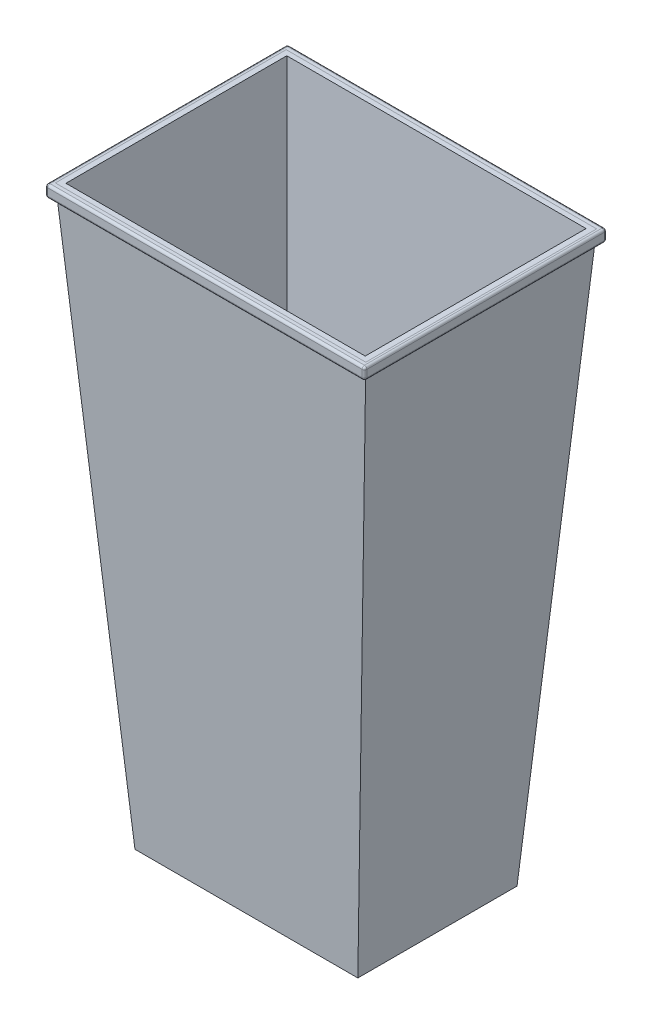
ISO-10303-21;
HEADER;
FILE_DESCRIPTION(('STEP AP214'),'2;1');
FILE_NAME('part.step','',(''),(''),'','','');
FILE_SCHEMA(('AUTOMOTIVE_DESIGN { 1 0 10303 214 1 1 1 1 }'));
ENDSEC;
DATA;
#1=APPLICATION_CONTEXT('core data for automotive mechanical design processes');
#2=APPLICATION_PROTOCOL_DEFINITION('international standard','automotive_design',2000,#1);
#3=PRODUCT_CONTEXT('',#1,'mechanical');
#4=PRODUCT('Part','Part','',(#3));
#5=PRODUCT_RELATED_PRODUCT_CATEGORY('part','',(#4));
#6=PRODUCT_DEFINITION_FORMATION('','',#4);
#7=PRODUCT_DEFINITION_CONTEXT('part definition',#1,'design');
#8=PRODUCT_DEFINITION('design','',#6,#7);
#9=PRODUCT_DEFINITION_SHAPE('','',#8);
#10=(LENGTH_UNIT() NAMED_UNIT(*) SI_UNIT(.MILLI.,.METRE.));
#11=(NAMED_UNIT(*) PLANE_ANGLE_UNIT() SI_UNIT($,.RADIAN.));
#12=(NAMED_UNIT(*) SI_UNIT($,.STERADIAN.) SOLID_ANGLE_UNIT());
#13=UNCERTAINTY_MEASURE_WITH_UNIT(LENGTH_MEASURE(1.E-05),#10,'distance_accuracy_value','');
#14=(GEOMETRIC_REPRESENTATION_CONTEXT(3) GLOBAL_UNCERTAINTY_ASSIGNED_CONTEXT((#13)) GLOBAL_UNIT_ASSIGNED_CONTEXT((#10,
#11,#12)) REPRESENTATION_CONTEXT('',''));
#15=CARTESIAN_POINT('',(0.,0.,0.));
#16=DIRECTION('',(0.,0.,1.));
#17=DIRECTION('',(1.,0.,0.));
#18=AXIS2_PLACEMENT_3D('',#15,#16,#17);
#19=CARTESIAN_POINT('',(200.524961783047,705.,-152.129640471292));
#20=DIRECTION('',(1.,0.,0.));
#21=DIRECTION('',(0.,0.,-1.));
#22=AXIS2_PLACEMENT_3D('',#19,#20,#21);
#23=PLANE('',#22);
#24=DIRECTION('',(0.,1.,0.));
#25=VECTOR('',#24,1.);
#26=CARTESIAN_POINT('',(200.524961783047,705.,149.129640471292));
#27=LINE('',#26,#25);
#28=CARTESIAN_POINT('',(200.524961783047,717.,149.129640471292));
#29=VERTEX_POINT('',#28);
#30=CARTESIAN_POINT('',(200.524961783047,708.,149.129640471292));
#31=VERTEX_POINT('',#30);
#32=EDGE_CURVE('E216',#29,#31,#27,.F.);
#33=ORIENTED_EDGE('',*,*,#32,.T.);
#34=DIRECTION('',(0.,0.,-1.));
#35=VECTOR('',#34,1.);
#36=CARTESIAN_POINT('',(200.524961783047,708.,-152.129640471292));
#37=LINE('',#36,#35);
#38=CARTESIAN_POINT('',(200.524961783047,708.,-149.129640471292));
#39=VERTEX_POINT('',#38);
#40=EDGE_CURVE('E221',#31,#39,#37,.T.);
#41=ORIENTED_EDGE('',*,*,#40,.T.);
#42=DIRECTION('',(0.,1.,0.));
#43=VECTOR('',#42,1.);
#44=CARTESIAN_POINT('',(200.524961783047,705.,-149.129640471292));
#45=LINE('',#44,#43);
#46=CARTESIAN_POINT('',(200.524961783047,717.,-149.129640471292));
#47=VERTEX_POINT('',#46);
#48=EDGE_CURVE('E218',#39,#47,#45,.T.);
#49=ORIENTED_EDGE('',*,*,#48,.T.);
#50=DIRECTION('',(0.,0.,-1.));
#51=VECTOR('',#50,1.);
#52=CARTESIAN_POINT('',(200.524961783047,717.,-152.129640471292));
#53=LINE('',#52,#51);
#54=EDGE_CURVE('E211',#47,#29,#53,.F.);
#55=ORIENTED_EDGE('',*,*,#54,.T.);
#56=EDGE_LOOP('',(#33,#41,#49,#55));
#57=FACE_BOUND('',#56,.T.);
#58=ADVANCED_FACE('F59',(#57),#23,.T.);
#59=CARTESIAN_POINT('',(-200.524961783047,705.,152.129640471292));
#60=DIRECTION('',(0.,0.,1.));
#61=DIRECTION('',(1.,0.,0.));
#62=AXIS2_PLACEMENT_3D('',#59,#60,#61);
#63=PLANE('',#62);
#64=DIRECTION('',(0.,1.,0.));
#65=VECTOR('',#64,1.);
#66=CARTESIAN_POINT('',(-197.524961783047,705.,152.129640471292));
#67=LINE('',#66,#65);
#68=CARTESIAN_POINT('',(-197.524961783047,717.,152.129640471292));
#69=VERTEX_POINT('',#68);
#70=CARTESIAN_POINT('',(-197.524961783047,708.,152.129640471292));
#71=VERTEX_POINT('',#70);
#72=EDGE_CURVE('E68',#69,#71,#67,.F.);
#73=ORIENTED_EDGE('',*,*,#72,.T.);
#74=DIRECTION('',(1.,0.,0.));
#75=VECTOR('',#74,1.);
#76=CARTESIAN_POINT('',(200.524961783047,708.,152.129640471292));
#77=LINE('',#76,#75);
#78=CARTESIAN_POINT('',(197.524961783047,708.,152.129640471292));
#79=VERTEX_POINT('',#78);
#80=EDGE_CURVE('E13',#71,#79,#77,.T.);
#81=ORIENTED_EDGE('',*,*,#80,.T.);
#82=DIRECTION('',(0.,1.,0.));
#83=VECTOR('',#82,1.);
#84=CARTESIAN_POINT('',(197.524961783047,705.,152.129640471292));
#85=LINE('',#84,#83);
#86=CARTESIAN_POINT('',(197.524961783047,717.,152.129640471292));
#87=VERTEX_POINT('',#86);
#88=EDGE_CURVE('E261',#79,#87,#85,.T.);
#89=ORIENTED_EDGE('',*,*,#88,.T.);
#90=DIRECTION('',(1.,0.,0.));
#91=VECTOR('',#90,1.);
#92=CARTESIAN_POINT('',(-200.524961783047,717.,152.129640471292));
#93=LINE('',#92,#91);
#94=EDGE_CURVE('E259',#87,#69,#93,.F.);
#95=ORIENTED_EDGE('',*,*,#94,.T.);
#96=EDGE_LOOP('',(#73,#81,#89,#95));
#97=FACE_BOUND('',#96,.T.);
#98=ADVANCED_FACE('F361',(#97),#63,.T.);
#99=CARTESIAN_POINT('',(-200.524961783047,705.,-152.129640471292));
#100=DIRECTION('',(-1.,0.,0.));
#101=DIRECTION('',(0.,0.,1.));
#102=AXIS2_PLACEMENT_3D('',#99,#100,#101);
#103=PLANE('',#102);
#104=DIRECTION('',(0.,1.,0.));
#105=VECTOR('',#104,1.);
#106=CARTESIAN_POINT('',(-200.524961783047,705.,-149.129640471292));
#107=LINE('',#106,#105);
#108=CARTESIAN_POINT('',(-200.524961783047,717.,-149.129640471292));
#109=VERTEX_POINT('',#108);
#110=CARTESIAN_POINT('',(-200.524961783047,708.,-149.129640471292));
#111=VERTEX_POINT('',#110);
#112=EDGE_CURVE('E254',#109,#111,#107,.F.);
#113=ORIENTED_EDGE('',*,*,#112,.T.);
#114=DIRECTION('',(0.,0.,1.));
#115=VECTOR('',#114,1.);
#116=CARTESIAN_POINT('',(-200.524961783047,708.,152.129640471292));
#117=LINE('',#116,#115);
#118=CARTESIAN_POINT('',(-200.524961783047,708.,149.129640471292));
#119=VERTEX_POINT('',#118);
#120=EDGE_CURVE('E257',#111,#119,#117,.T.);
#121=ORIENTED_EDGE('',*,*,#120,.T.);
#122=DIRECTION('',(0.,1.,0.));
#123=VECTOR('',#122,1.);
#124=CARTESIAN_POINT('',(-200.524961783047,705.,149.129640471292));
#125=LINE('',#124,#123);
#126=CARTESIAN_POINT('',(-200.524961783047,717.,149.129640471292));
#127=VERTEX_POINT('',#126);
#128=EDGE_CURVE('E252',#119,#127,#125,.T.);
#129=ORIENTED_EDGE('',*,*,#128,.T.);
#130=DIRECTION('',(0.,0.,1.));
#131=VECTOR('',#130,1.);
#132=CARTESIAN_POINT('',(-200.524961783047,717.,-152.129640471292));
#133=LINE('',#132,#131);
#134=EDGE_CURVE('E250',#127,#109,#133,.F.);
#135=ORIENTED_EDGE('',*,*,#134,.T.);
#136=EDGE_LOOP('',(#113,#121,#129,#135));
#137=FACE_BOUND('',#136,.T.);
#138=ADVANCED_FACE('F368',(#137),#103,.T.);
#139=CARTESIAN_POINT('',(-200.524961783047,705.,-152.129640471292));
#140=DIRECTION('',(0.,0.,-1.));
#141=DIRECTION('',(-1.,0.,0.));
#142=AXIS2_PLACEMENT_3D('',#139,#140,#141);
#143=PLANE('',#142);
#144=DIRECTION('',(-1.,0.,0.));
#145=VECTOR('',#144,1.);
#146=CARTESIAN_POINT('',(-200.524961783047,717.,-152.129640471292));
#147=LINE('',#146,#145);
#148=CARTESIAN_POINT('',(-197.524961783047,717.,-152.129640471292));
#149=VERTEX_POINT('',#148);
#150=CARTESIAN_POINT('',(197.524961783047,717.,-152.129640471292));
#151=VERTEX_POINT('',#150);
#152=EDGE_CURVE('E225',#149,#151,#147,.F.);
#153=ORIENTED_EDGE('',*,*,#152,.T.);
#154=DIRECTION('',(0.,1.,0.));
#155=VECTOR('',#154,1.);
#156=CARTESIAN_POINT('',(197.524961783047,705.,-152.129640471292));
#157=LINE('',#156,#155);
#158=CARTESIAN_POINT('',(197.524961783047,708.,-152.129640471292));
#159=VERTEX_POINT('',#158);
#160=EDGE_CURVE('E229',#151,#159,#157,.F.);
#161=ORIENTED_EDGE('',*,*,#160,.T.);
#162=DIRECTION('',(-1.,0.,0.));
#163=VECTOR('',#162,1.);
#164=CARTESIAN_POINT('',(-200.524961783047,708.,-152.129640471292));
#165=LINE('',#164,#163);
#166=CARTESIAN_POINT('',(-197.524961783047,708.,-152.129640471292));
#167=VERTEX_POINT('',#166);
#168=EDGE_CURVE('E227',#159,#167,#165,.T.);
#169=ORIENTED_EDGE('',*,*,#168,.T.);
#170=DIRECTION('',(0.,1.,0.));
#171=VECTOR('',#170,1.);
#172=CARTESIAN_POINT('',(-197.524961783047,705.,-152.129640471292));
#173=LINE('',#172,#171);
#174=EDGE_CURVE('E223',#167,#149,#173,.T.);
#175=ORIENTED_EDGE('',*,*,#174,.T.);
#176=EDGE_LOOP('',(#153,#161,#169,#175));
#177=FACE_BOUND('',#176,.T.);
#178=ADVANCED_FACE('F372',(#177),#143,.T.);
#179=CARTESIAN_POINT('',(0.,705.,0.));
#180=DIRECTION('',(0.,1.,0.));
#181=DIRECTION('',(0.,0.,1.));
#182=AXIS2_PLACEMENT_3D('',#179,#180,#181);
#183=PLANE('',#182);
#184=DIRECTION('',(0.,0.,1.));
#185=VECTOR('',#184,1.);
#186=CARTESIAN_POINT('',(-197.524961783047,705.,-152.129640471292));
#187=LINE('',#186,#185);
#188=CARTESIAN_POINT('',(-197.524961783047,705.,149.129640471292));
#189=VERTEX_POINT('',#188);
#190=CARTESIAN_POINT('',(-197.524961783047,705.,-149.129640471292));
#191=VERTEX_POINT('',#190);
#192=EDGE_CURVE('E234',#189,#191,#187,.F.);
#193=ORIENTED_EDGE('',*,*,#192,.T.);
#194=DIRECTION('',(-1.,0.,0.));
#195=VECTOR('',#194,1.);
#196=CARTESIAN_POINT('',(200.524961783047,705.,-149.129640471292));
#197=LINE('',#196,#195);
#198=CARTESIAN_POINT('',(197.524961783047,705.,-149.129640471292));
#199=VERTEX_POINT('',#198);
#200=EDGE_CURVE('E238',#191,#199,#197,.F.);
#201=ORIENTED_EDGE('',*,*,#200,.T.);
#202=DIRECTION('',(0.,0.,-1.));
#203=VECTOR('',#202,1.);
#204=CARTESIAN_POINT('',(197.524961783047,705.,152.129640471292));
#205=LINE('',#204,#203);
#206=CARTESIAN_POINT('',(197.524961783047,705.,149.129640471292));
#207=VERTEX_POINT('',#206);
#208=EDGE_CURVE('E236',#199,#207,#205,.F.);
#209=ORIENTED_EDGE('',*,*,#208,.T.);
#210=DIRECTION('',(1.,0.,0.));
#211=VECTOR('',#210,1.);
#212=CARTESIAN_POINT('',(-200.524961783047,705.,149.129640471292));
#213=LINE('',#212,#211);
#214=EDGE_CURVE('E232',#207,#189,#213,.F.);
#215=ORIENTED_EDGE('',*,*,#214,.T.);
#216=EDGE_LOOP('',(#193,#201,#209,#215));
#217=FACE_BOUND('',#216,.T.);
#218=DIRECTION('',(1.,0.,0.));
#219=VECTOR('',#218,1.);
#220=CARTESIAN_POINT('',(-195.,705.,145.));
#221=LINE('',#220,#219);
#222=CARTESIAN_POINT('',(-195.,705.,145.));
#223=VERTEX_POINT('',#222);
#224=CARTESIAN_POINT('',(195.,705.,145.));
#225=VERTEX_POINT('',#224);
#226=EDGE_CURVE('E184',#223,#225,#221,.T.);
#227=ORIENTED_EDGE('',*,*,#226,.T.);
#228=DIRECTION('',(0.,0.,-1.));
#229=VECTOR('',#228,1.);
#230=CARTESIAN_POINT('',(195.,705.,-145.));
#231=LINE('',#230,#229);
#232=CARTESIAN_POINT('',(195.,705.,-145.));
#233=VERTEX_POINT('',#232);
#234=EDGE_CURVE('E176',#225,#233,#231,.T.);
#235=ORIENTED_EDGE('',*,*,#234,.T.);
#236=DIRECTION('',(-1.,0.,0.));
#237=VECTOR('',#236,1.);
#238=CARTESIAN_POINT('',(-195.,705.,-145.));
#239=LINE('',#238,#237);
#240=CARTESIAN_POINT('',(-195.,705.,-145.));
#241=VERTEX_POINT('',#240);
#242=EDGE_CURVE('E188',#233,#241,#239,.T.);
#243=ORIENTED_EDGE('',*,*,#242,.T.);
#244=DIRECTION('',(0.,0.,1.));
#245=VECTOR('',#244,1.);
#246=CARTESIAN_POINT('',(-195.,705.,-145.));
#247=LINE('',#246,#245);
#248=EDGE_CURVE('E192',#241,#223,#247,.T.);
#249=ORIENTED_EDGE('',*,*,#248,.T.);
#250=EDGE_LOOP('',(#227,#235,#243,#249));
#251=FACE_BOUND('',#250,.T.);
#252=ADVANCED_FACE('F194',(#217,#251),#183,.F.);
#253=CARTESIAN_POINT('',(0.,720.,0.));
#254=DIRECTION('',(0.,1.,0.));
#255=DIRECTION('',(0.,0.,1.));
#256=AXIS2_PLACEMENT_3D('',#253,#254,#255);
#257=PLANE('',#256);
#258=DIRECTION('',(0.,0.,-1.));
#259=VECTOR('',#258,1.);
#260=CARTESIAN_POINT('',(197.524961783047,720.,0.));
#261=LINE('',#260,#259);
#262=CARTESIAN_POINT('',(197.524961783047,720.,149.129640471292));
#263=VERTEX_POINT('',#262);
#264=CARTESIAN_POINT('',(197.524961783047,720.,-149.129640471292));
#265=VERTEX_POINT('',#264);
#266=EDGE_CURVE('E245',#263,#265,#261,.T.);
#267=ORIENTED_EDGE('',*,*,#266,.T.);
#268=DIRECTION('',(-1.,0.,0.));
#269=VECTOR('',#268,1.);
#270=CARTESIAN_POINT('',(0.,720.,-149.129640471292));
#271=LINE('',#270,#269);
#272=CARTESIAN_POINT('',(-197.524961783047,720.,-149.129640471292));
#273=VERTEX_POINT('',#272);
#274=EDGE_CURVE('E247',#265,#273,#271,.T.);
#275=ORIENTED_EDGE('',*,*,#274,.T.);
#276=DIRECTION('',(0.,0.,1.));
#277=VECTOR('',#276,1.);
#278=CARTESIAN_POINT('',(-197.524961783047,720.,0.));
#279=LINE('',#278,#277);
#280=CARTESIAN_POINT('',(-197.524961783047,720.,149.129640471292));
#281=VERTEX_POINT('',#280);
#282=EDGE_CURVE('E243',#273,#281,#279,.T.);
#283=ORIENTED_EDGE('',*,*,#282,.T.);
#284=DIRECTION('',(1.,0.,0.));
#285=VECTOR('',#284,1.);
#286=CARTESIAN_POINT('',(0.,720.,149.129640471292));
#287=LINE('',#286,#285);
#288=EDGE_CURVE('E241',#281,#263,#287,.T.);
#289=ORIENTED_EDGE('',*,*,#288,.T.);
#290=EDGE_LOOP('',(#267,#275,#283,#289));
#291=FACE_BOUND('',#290,.T.);
#292=DIRECTION('',(0.,0.,-1.));
#293=VECTOR('',#292,1.);
#294=CARTESIAN_POINT('',(195.,720.,-145.));
#295=LINE('',#294,#293);
#296=CARTESIAN_POINT('',(195.,720.,145.));
#297=VERTEX_POINT('',#296);
#298=CARTESIAN_POINT('',(195.,720.,-145.));
#299=VERTEX_POINT('',#298);
#300=EDGE_CURVE('E179',#297,#299,#295,.T.);
#301=ORIENTED_EDGE('',*,*,#300,.F.);
#302=DIRECTION('',(1.,0.,0.));
#303=VECTOR('',#302,1.);
#304=CARTESIAN_POINT('',(-195.,720.,145.));
#305=LINE('',#304,#303);
#306=CARTESIAN_POINT('',(-195.,720.,145.));
#307=VERTEX_POINT('',#306);
#308=EDGE_CURVE('E196',#307,#297,#305,.T.);
#309=ORIENTED_EDGE('',*,*,#308,.F.);
#310=DIRECTION('',(0.,0.,1.));
#311=VECTOR('',#310,1.);
#312=CARTESIAN_POINT('',(-195.,720.,-145.));
#313=LINE('',#312,#311);
#314=CARTESIAN_POINT('',(-195.,720.,-145.));
#315=VERTEX_POINT('',#314);
#316=EDGE_CURVE('E199',#315,#307,#313,.T.);
#317=ORIENTED_EDGE('',*,*,#316,.F.);
#318=DIRECTION('',(-1.,0.,0.));
#319=VECTOR('',#318,1.);
#320=CARTESIAN_POINT('',(-195.,720.,-145.));
#321=LINE('',#320,#319);
#322=EDGE_CURVE('E205',#299,#315,#321,.T.);
#323=ORIENTED_EDGE('',*,*,#322,.F.);
#324=EDGE_LOOP('',(#301,#309,#317,#323));
#325=FACE_BOUND('',#324,.T.);
#326=ADVANCED_FACE('F468',(#291,#325),#257,.T.);
#327=CARTESIAN_POINT('',(195.,705.,-145.));
#328=DIRECTION('',(1.,0.,0.));
#329=DIRECTION('',(0.,0.,-1.));
#330=AXIS2_PLACEMENT_3D('',#327,#328,#329);
#331=PLANE('',#330);
#332=ORIENTED_EDGE('',*,*,#300,.T.);
#333=DIRECTION('',(0.,1.,0.));
#334=VECTOR('',#333,1.);
#335=CARTESIAN_POINT('',(195.,705.,-145.));
#336=LINE('',#335,#334);
#337=EDGE_CURVE('E172',#233,#299,#336,.T.);
#338=ORIENTED_EDGE('',*,*,#337,.F.);
#339=ORIENTED_EDGE('',*,*,#234,.F.);
#340=DIRECTION('',(0.,1.,0.));
#341=VECTOR('',#340,1.);
#342=CARTESIAN_POINT('',(195.,705.,145.));
#343=LINE('',#342,#341);
#344=EDGE_CURVE('E209',#225,#297,#343,.T.);
#345=ORIENTED_EDGE('',*,*,#344,.T.);
#346=EDGE_LOOP('',(#332,#338,#339,#345));
#347=FACE_BOUND('',#346,.T.);
#348=ADVANCED_FACE('F174',(#347),#331,.F.);
#349=CARTESIAN_POINT('',(-195.,705.,145.));
#350=DIRECTION('',(0.,0.,1.));
#351=DIRECTION('',(1.,0.,0.));
#352=AXIS2_PLACEMENT_3D('',#349,#350,#351);
#353=PLANE('',#352);
#354=ORIENTED_EDGE('',*,*,#308,.T.);
#355=ORIENTED_EDGE('',*,*,#344,.F.);
#356=ORIENTED_EDGE('',*,*,#226,.F.);
#357=DIRECTION('',(0.,1.,0.));
#358=VECTOR('',#357,1.);
#359=CARTESIAN_POINT('',(-195.,705.,145.));
#360=LINE('',#359,#358);
#361=EDGE_CURVE('E212',#223,#307,#360,.T.);
#362=ORIENTED_EDGE('',*,*,#361,.T.);
#363=EDGE_LOOP('',(#354,#355,#356,#362));
#364=FACE_BOUND('',#363,.T.);
#365=ADVANCED_FACE('F461',(#364),#353,.F.);
#366=CARTESIAN_POINT('',(-195.,705.,-145.));
#367=DIRECTION('',(-1.,0.,0.));
#368=DIRECTION('',(0.,0.,1.));
#369=AXIS2_PLACEMENT_3D('',#366,#367,#368);
#370=PLANE('',#369);
#371=ORIENTED_EDGE('',*,*,#316,.T.);
#372=ORIENTED_EDGE('',*,*,#361,.F.);
#373=ORIENTED_EDGE('',*,*,#248,.F.);
#374=DIRECTION('',(0.,1.,0.));
#375=VECTOR('',#374,1.);
#376=CARTESIAN_POINT('',(-195.,705.,-145.));
#377=LINE('',#376,#375);
#378=EDGE_CURVE('E183',#241,#315,#377,.T.);
#379=ORIENTED_EDGE('',*,*,#378,.T.);
#380=EDGE_LOOP('',(#371,#372,#373,#379));
#381=FACE_BOUND('',#380,.T.);
#382=ADVANCED_FACE('F456',(#381),#370,.F.);
#383=CARTESIAN_POINT('',(-195.,705.,-145.));
#384=DIRECTION('',(0.,0.,-1.));
#385=DIRECTION('',(-1.,0.,0.));
#386=AXIS2_PLACEMENT_3D('',#383,#384,#385);
#387=PLANE('',#386);
#388=ORIENTED_EDGE('',*,*,#322,.T.);
#389=ORIENTED_EDGE('',*,*,#378,.F.);
#390=ORIENTED_EDGE('',*,*,#242,.F.);
#391=ORIENTED_EDGE('',*,*,#337,.T.);
#392=EDGE_LOOP('',(#388,#389,#390,#391));
#393=FACE_BOUND('',#392,.T.);
#394=ADVANCED_FACE('F189',(#393),#387,.F.);
#395=CARTESIAN_POINT('',(-197.524961783047,705.,149.129640471292));
#396=DIRECTION('',(0.,1.,0.));
#397=DIRECTION('',(0.,0.,1.));
#398=AXIS2_PLACEMENT_3D('',#395,#396,#397);
#399=CYLINDRICAL_SURFACE('',#398,3.);
#400=CARTESIAN_POINT('',(-197.524961783047,708.,149.129640471292));
#401=DIRECTION('',(0.,-1.,0.));
#402=DIRECTION('',(0.,0.,-1.));
#403=AXIS2_PLACEMENT_3D('',#400,#401,#402);
#404=CIRCLE('',#403,3.);
#405=EDGE_CURVE('E63',#71,#119,#404,.T.);
#406=ORIENTED_EDGE('',*,*,#405,.F.);
#407=ORIENTED_EDGE('',*,*,#72,.F.);
#408=CARTESIAN_POINT('',(-197.524961783047,717.,149.129640471292));
#409=DIRECTION('',(0.,1.,0.));
#410=DIRECTION('',(0.,0.,1.));
#411=AXIS2_PLACEMENT_3D('',#408,#409,#410);
#412=CIRCLE('',#411,3.);
#413=EDGE_CURVE('E323',#127,#69,#412,.T.);
#414=ORIENTED_EDGE('',*,*,#413,.F.);
#415=ORIENTED_EDGE('',*,*,#128,.F.);
#416=EDGE_LOOP('',(#406,#407,#414,#415));
#417=FACE_BOUND('',#416,.T.);
#418=ADVANCED_FACE('F61',(#417),#399,.T.);
#419=CARTESIAN_POINT('',(-197.524961783047,708.,149.129640471292));
#420=DIRECTION('',(-1.,0.,0.));
#421=DIRECTION('',(0.,0.,1.));
#422=AXIS2_PLACEMENT_3D('',#419,#420,#421);
#423=SPHERICAL_SURFACE('',#422,3.);
#424=CARTESIAN_POINT('',(-197.524961783047,708.,149.129640471292));
#425=DIRECTION('',(-1.,0.,0.));
#426=DIRECTION('',(0.,0.,1.));
#427=AXIS2_PLACEMENT_3D('',#424,#425,#426);
#428=CIRCLE('',#427,3.);
#429=EDGE_CURVE('E319',#71,#189,#428,.F.);
#430=ORIENTED_EDGE('',*,*,#429,.F.);
#431=ORIENTED_EDGE('',*,*,#405,.T.);
#432=CARTESIAN_POINT('',(-197.524961783047,708.,149.129640471292));
#433=DIRECTION('',(0.,0.,1.));
#434=DIRECTION('',(1.,0.,0.));
#435=AXIS2_PLACEMENT_3D('',#432,#433,#434);
#436=CIRCLE('',#435,3.);
#437=EDGE_CURVE('E321',#189,#119,#436,.F.);
#438=ORIENTED_EDGE('',*,*,#437,.F.);
#439=EDGE_LOOP('',(#430,#431,#438));
#440=FACE_BOUND('',#439,.T.);
#441=ADVANCED_FACE('F333',(#440),#423,.T.);
#442=CARTESIAN_POINT('',(-197.524961783047,717.,149.129640471292));
#443=DIRECTION('',(0.,0.,1.));
#444=DIRECTION('',(1.,0.,0.));
#445=AXIS2_PLACEMENT_3D('',#442,#443,#444);
#446=SPHERICAL_SURFACE('',#445,3.);
#447=CARTESIAN_POINT('',(-197.524961783047,717.,149.129640471292));
#448=DIRECTION('',(0.,0.,1.));
#449=DIRECTION('',(1.,0.,0.));
#450=AXIS2_PLACEMENT_3D('',#447,#448,#449);
#451=CIRCLE('',#450,3.);
#452=EDGE_CURVE('E313',#127,#281,#451,.F.);
#453=ORIENTED_EDGE('',*,*,#452,.F.);
#454=ORIENTED_EDGE('',*,*,#413,.T.);
#455=CARTESIAN_POINT('',(-197.524961783047,717.,149.129640471292));
#456=DIRECTION('',(-1.,0.,0.));
#457=DIRECTION('',(0.,0.,1.));
#458=AXIS2_PLACEMENT_3D('',#455,#456,#457);
#459=CIRCLE('',#458,3.);
#460=EDGE_CURVE('E316',#281,#69,#459,.F.);
#461=ORIENTED_EDGE('',*,*,#460,.F.);
#462=EDGE_LOOP('',(#453,#454,#461));
#463=FACE_BOUND('',#462,.T.);
#464=ADVANCED_FACE('F358',(#463),#446,.T.);
#465=CARTESIAN_POINT('',(-197.524961783047,708.,-152.129640471292));
#466=DIRECTION('',(0.,0.,-1.));
#467=DIRECTION('',(-1.,0.,0.));
#468=AXIS2_PLACEMENT_3D('',#465,#466,#467);
#469=CYLINDRICAL_SURFACE('',#468,3.);
#470=ORIENTED_EDGE('',*,*,#437,.T.);
#471=ORIENTED_EDGE('',*,*,#120,.F.);
#472=CARTESIAN_POINT('',(-197.524961783047,708.,-149.129640471292));
#473=DIRECTION('',(0.,0.,-1.));
#474=DIRECTION('',(-1.,0.,0.));
#475=AXIS2_PLACEMENT_3D('',#472,#473,#474);
#476=CIRCLE('',#475,3.);
#477=EDGE_CURVE('E308',#191,#111,#476,.T.);
#478=ORIENTED_EDGE('',*,*,#477,.F.);
#479=ORIENTED_EDGE('',*,*,#192,.F.);
#480=EDGE_LOOP('',(#470,#471,#478,#479));
#481=FACE_BOUND('',#480,.T.);
#482=ADVANCED_FACE('F340',(#481),#469,.T.);
#483=CARTESIAN_POINT('',(-200.524961783047,708.,149.129640471292));
#484=DIRECTION('',(-1.,0.,0.));
#485=DIRECTION('',(0.,0.,1.));
#486=AXIS2_PLACEMENT_3D('',#483,#484,#485);
#487=CYLINDRICAL_SURFACE('',#486,3.);
#488=ORIENTED_EDGE('',*,*,#429,.T.);
#489=ORIENTED_EDGE('',*,*,#214,.F.);
#490=CARTESIAN_POINT('',(197.524961783047,708.,149.129640471292));
#491=DIRECTION('',(1.,0.,0.));
#492=DIRECTION('',(0.,0.,-1.));
#493=AXIS2_PLACEMENT_3D('',#490,#491,#492);
#494=CIRCLE('',#493,3.);
#495=EDGE_CURVE('E305',#79,#207,#494,.T.);
#496=ORIENTED_EDGE('',*,*,#495,.F.);
#497=ORIENTED_EDGE('',*,*,#80,.F.);
#498=EDGE_LOOP('',(#488,#489,#496,#497));
#499=FACE_BOUND('',#498,.T.);
#500=ADVANCED_FACE('F347',(#499),#487,.T.);
#501=CARTESIAN_POINT('',(197.524961783047,705.,149.129640471292));
#502=DIRECTION('',(0.,1.,0.));
#503=DIRECTION('',(0.,0.,1.));
#504=AXIS2_PLACEMENT_3D('',#501,#502,#503);
#505=CYLINDRICAL_SURFACE('',#504,3.);
#506=CARTESIAN_POINT('',(197.524961783047,717.,149.129640471292));
#507=DIRECTION('',(0.,1.,0.));
#508=DIRECTION('',(0.,0.,1.));
#509=AXIS2_PLACEMENT_3D('',#506,#507,#508);
#510=CIRCLE('',#509,3.);
#511=EDGE_CURVE('E299',#87,#29,#510,.T.);
#512=ORIENTED_EDGE('',*,*,#511,.F.);
#513=ORIENTED_EDGE('',*,*,#88,.F.);
#514=CARTESIAN_POINT('',(197.524961783047,708.,149.129640471292));
#515=DIRECTION('',(0.,-1.,0.));
#516=DIRECTION('',(0.,0.,-1.));
#517=AXIS2_PLACEMENT_3D('',#514,#515,#516);
#518=CIRCLE('',#517,3.);
#519=EDGE_CURVE('E302',#31,#79,#518,.T.);
#520=ORIENTED_EDGE('',*,*,#519,.F.);
#521=ORIENTED_EDGE('',*,*,#32,.F.);
#522=EDGE_LOOP('',(#512,#513,#520,#521));
#523=FACE_BOUND('',#522,.T.);
#524=ADVANCED_FACE('F349',(#523),#505,.T.);
#525=CARTESIAN_POINT('',(0.,717.,149.129640471292));
#526=DIRECTION('',(1.,0.,0.));
#527=DIRECTION('',(0.,0.,-1.));
#528=AXIS2_PLACEMENT_3D('',#525,#526,#527);
#529=CYLINDRICAL_SURFACE('',#528,3.);
#530=ORIENTED_EDGE('',*,*,#460,.T.);
#531=ORIENTED_EDGE('',*,*,#94,.F.);
#532=CARTESIAN_POINT('',(197.524961783047,717.,149.129640471292));
#533=DIRECTION('',(1.,0.,0.));
#534=DIRECTION('',(0.,0.,-1.));
#535=AXIS2_PLACEMENT_3D('',#532,#533,#534);
#536=CIRCLE('',#535,3.);
#537=EDGE_CURVE('E296',#263,#87,#536,.T.);
#538=ORIENTED_EDGE('',*,*,#537,.F.);
#539=ORIENTED_EDGE('',*,*,#288,.F.);
#540=EDGE_LOOP('',(#530,#531,#538,#539));
#541=FACE_BOUND('',#540,.T.);
#542=ADVANCED_FACE('F355',(#541),#529,.T.);
#543=CARTESIAN_POINT('',(-197.524961783047,717.,0.));
#544=DIRECTION('',(0.,0.,1.));
#545=DIRECTION('',(1.,0.,0.));
#546=AXIS2_PLACEMENT_3D('',#543,#544,#545);
#547=CYLINDRICAL_SURFACE('',#546,3.);
#548=ORIENTED_EDGE('',*,*,#452,.T.);
#549=ORIENTED_EDGE('',*,*,#282,.F.);
#550=CARTESIAN_POINT('',(-197.524961783047,717.,-149.129640471292));
#551=DIRECTION('',(0.,0.,-1.));
#552=DIRECTION('',(-1.,0.,0.));
#553=AXIS2_PLACEMENT_3D('',#550,#551,#552);
#554=CIRCLE('',#553,3.);
#555=EDGE_CURVE('E293',#109,#273,#554,.T.);
#556=ORIENTED_EDGE('',*,*,#555,.F.);
#557=ORIENTED_EDGE('',*,*,#134,.F.);
#558=EDGE_LOOP('',(#548,#549,#556,#557));
#559=FACE_BOUND('',#558,.T.);
#560=ADVANCED_FACE('F421',(#559),#547,.T.);
#561=CARTESIAN_POINT('',(-197.524961783047,705.,-149.129640471292));
#562=DIRECTION('',(0.,1.,0.));
#563=DIRECTION('',(0.,0.,1.));
#564=AXIS2_PLACEMENT_3D('',#561,#562,#563);
#565=CYLINDRICAL_SURFACE('',#564,3.);
#566=CARTESIAN_POINT('',(-197.524961783047,708.,-149.129640471292));
#567=DIRECTION('',(0.,-1.,0.));
#568=DIRECTION('',(0.,0.,-1.));
#569=AXIS2_PLACEMENT_3D('',#566,#567,#568);
#570=CIRCLE('',#569,3.);
#571=EDGE_CURVE('E310',#111,#167,#570,.T.);
#572=ORIENTED_EDGE('',*,*,#571,.F.);
#573=ORIENTED_EDGE('',*,*,#112,.F.);
#574=CARTESIAN_POINT('',(-197.524961783047,717.,-149.129640471292));
#575=DIRECTION('',(0.,1.,0.));
#576=DIRECTION('',(0.,0.,1.));
#577=AXIS2_PLACEMENT_3D('',#574,#575,#576);
#578=CIRCLE('',#577,3.);
#579=EDGE_CURVE('E290',#149,#109,#578,.T.);
#580=ORIENTED_EDGE('',*,*,#579,.F.);
#581=ORIENTED_EDGE('',*,*,#174,.F.);
#582=EDGE_LOOP('',(#572,#573,#580,#581));
#583=FACE_BOUND('',#582,.T.);
#584=ADVANCED_FACE('F417',(#583),#565,.T.);
#585=CARTESIAN_POINT('',(-197.524961783047,708.,-149.129640471292));
#586=DIRECTION('',(-1.,0.,0.));
#587=DIRECTION('',(0.,0.,1.));
#588=AXIS2_PLACEMENT_3D('',#585,#586,#587);
#589=SPHERICAL_SURFACE('',#588,3.);
#590=ORIENTED_EDGE('',*,*,#477,.T.);
#591=ORIENTED_EDGE('',*,*,#571,.T.);
#592=CARTESIAN_POINT('',(-197.524961783047,708.,-149.129640471292));
#593=DIRECTION('',(-1.,0.,0.));
#594=DIRECTION('',(0.,0.,1.));
#595=AXIS2_PLACEMENT_3D('',#592,#593,#594);
#596=CIRCLE('',#595,3.);
#597=EDGE_CURVE('E287',#191,#167,#596,.F.);
#598=ORIENTED_EDGE('',*,*,#597,.F.);
#599=EDGE_LOOP('',(#590,#591,#598));
#600=FACE_BOUND('',#599,.T.);
#601=ADVANCED_FACE('F413',(#600),#589,.T.);
#602=CARTESIAN_POINT('',(197.524961783047,708.,149.129640471292));
#603=DIRECTION('',(0.,0.,1.));
#604=DIRECTION('',(1.,0.,0.));
#605=AXIS2_PLACEMENT_3D('',#602,#603,#604);
#606=SPHERICAL_SURFACE('',#605,3.);
#607=ORIENTED_EDGE('',*,*,#519,.T.);
#608=ORIENTED_EDGE('',*,*,#495,.T.);
#609=CARTESIAN_POINT('',(197.524961783047,708.,149.129640471292));
#610=DIRECTION('',(0.,0.,1.));
#611=DIRECTION('',(1.,0.,0.));
#612=AXIS2_PLACEMENT_3D('',#609,#610,#611);
#613=CIRCLE('',#612,3.);
#614=EDGE_CURVE('E284',#31,#207,#613,.F.);
#615=ORIENTED_EDGE('',*,*,#614,.F.);
#616=EDGE_LOOP('',(#607,#608,#615));
#617=FACE_BOUND('',#616,.T.);
#618=ADVANCED_FACE('F409',(#617),#606,.T.);
#619=CARTESIAN_POINT('',(197.524961783047,717.,149.129640471292));
#620=DIRECTION('',(0.,0.,1.));
#621=DIRECTION('',(1.,0.,0.));
#622=AXIS2_PLACEMENT_3D('',#619,#620,#621);
#623=SPHERICAL_SURFACE('',#622,3.);
#624=ORIENTED_EDGE('',*,*,#537,.T.);
#625=ORIENTED_EDGE('',*,*,#511,.T.);
#626=CARTESIAN_POINT('',(197.524961783047,717.,149.129640471292));
#627=DIRECTION('',(0.,0.,1.));
#628=DIRECTION('',(1.,0.,0.));
#629=AXIS2_PLACEMENT_3D('',#626,#627,#628);
#630=CIRCLE('',#629,3.);
#631=EDGE_CURVE('E281',#263,#29,#630,.F.);
#632=ORIENTED_EDGE('',*,*,#631,.F.);
#633=EDGE_LOOP('',(#624,#625,#632));
#634=FACE_BOUND('',#633,.T.);
#635=ADVANCED_FACE('F405',(#634),#623,.T.);
#636=CARTESIAN_POINT('',(-197.524961783047,717.,-149.129640471292));
#637=DIRECTION('',(-1.,0.,0.));
#638=DIRECTION('',(0.,0.,1.));
#639=AXIS2_PLACEMENT_3D('',#636,#637,#638);
#640=SPHERICAL_SURFACE('',#639,3.);
#641=ORIENTED_EDGE('',*,*,#579,.T.);
#642=ORIENTED_EDGE('',*,*,#555,.T.);
#643=CARTESIAN_POINT('',(-197.524961783047,717.,-149.129640471292));
#644=DIRECTION('',(-1.,0.,0.));
#645=DIRECTION('',(0.,0.,1.));
#646=AXIS2_PLACEMENT_3D('',#643,#644,#645);
#647=CIRCLE('',#646,3.);
#648=EDGE_CURVE('E279',#149,#273,#647,.F.);
#649=ORIENTED_EDGE('',*,*,#648,.F.);
#650=EDGE_LOOP('',(#641,#642,#649));
#651=FACE_BOUND('',#650,.T.);
#652=ADVANCED_FACE('F401',(#651),#640,.T.);
#653=CARTESIAN_POINT('',(-200.524961783047,708.,-149.129640471292));
#654=DIRECTION('',(1.,0.,0.));
#655=DIRECTION('',(0.,0.,-1.));
#656=AXIS2_PLACEMENT_3D('',#653,#654,#655);
#657=CYLINDRICAL_SURFACE('',#656,3.);
#658=ORIENTED_EDGE('',*,*,#597,.T.);
#659=ORIENTED_EDGE('',*,*,#168,.F.);
#660=CARTESIAN_POINT('',(197.524961783047,708.,-149.129640471292));
#661=DIRECTION('',(1.,0.,0.));
#662=DIRECTION('',(0.,0.,-1.));
#663=AXIS2_PLACEMENT_3D('',#660,#661,#662);
#664=CIRCLE('',#663,3.);
#665=EDGE_CURVE('E276',#199,#159,#664,.T.);
#666=ORIENTED_EDGE('',*,*,#665,.F.);
#667=ORIENTED_EDGE('',*,*,#200,.F.);
#668=EDGE_LOOP('',(#658,#659,#666,#667));
#669=FACE_BOUND('',#668,.T.);
#670=ADVANCED_FACE('F397',(#669),#657,.T.);
#671=CARTESIAN_POINT('',(197.524961783047,708.,-152.129640471292));
#672=DIRECTION('',(0.,0.,1.));
#673=DIRECTION('',(1.,0.,0.));
#674=AXIS2_PLACEMENT_3D('',#671,#672,#673);
#675=CYLINDRICAL_SURFACE('',#674,3.);
#676=ORIENTED_EDGE('',*,*,#614,.T.);
#677=ORIENTED_EDGE('',*,*,#208,.F.);
#678=CARTESIAN_POINT('',(197.524961783047,708.,-149.129640471292));
#679=DIRECTION('',(0.,0.,-1.));
#680=DIRECTION('',(-1.,0.,0.));
#681=AXIS2_PLACEMENT_3D('',#678,#679,#680);
#682=CIRCLE('',#681,3.);
#683=EDGE_CURVE('E274',#39,#199,#682,.T.);
#684=ORIENTED_EDGE('',*,*,#683,.F.);
#685=ORIENTED_EDGE('',*,*,#40,.F.);
#686=EDGE_LOOP('',(#676,#677,#684,#685));
#687=FACE_BOUND('',#686,.T.);
#688=ADVANCED_FACE('F393',(#687),#675,.T.);
#689=CARTESIAN_POINT('',(197.524961783047,717.,0.));
#690=DIRECTION('',(0.,0.,-1.));
#691=DIRECTION('',(-1.,0.,0.));
#692=AXIS2_PLACEMENT_3D('',#689,#690,#691);
#693=CYLINDRICAL_SURFACE('',#692,3.);
#694=ORIENTED_EDGE('',*,*,#631,.T.);
#695=ORIENTED_EDGE('',*,*,#54,.F.);
#696=CARTESIAN_POINT('',(197.524961783047,717.,-149.129640471292));
#697=DIRECTION('',(0.,0.,-1.));
#698=DIRECTION('',(-1.,0.,0.));
#699=AXIS2_PLACEMENT_3D('',#696,#697,#698);
#700=CIRCLE('',#699,3.);
#701=EDGE_CURVE('E271',#265,#47,#700,.T.);
#702=ORIENTED_EDGE('',*,*,#701,.F.);
#703=ORIENTED_EDGE('',*,*,#266,.F.);
#704=EDGE_LOOP('',(#694,#695,#702,#703));
#705=FACE_BOUND('',#704,.T.);
#706=ADVANCED_FACE('F389',(#705),#693,.T.);
#707=CARTESIAN_POINT('',(0.,717.,-149.129640471292));
#708=DIRECTION('',(-1.,0.,0.));
#709=DIRECTION('',(0.,0.,1.));
#710=AXIS2_PLACEMENT_3D('',#707,#708,#709);
#711=CYLINDRICAL_SURFACE('',#710,3.);
#712=ORIENTED_EDGE('',*,*,#648,.T.);
#713=ORIENTED_EDGE('',*,*,#274,.F.);
#714=CARTESIAN_POINT('',(197.524961783047,717.,-149.129640471292));
#715=DIRECTION('',(1.,0.,0.));
#716=DIRECTION('',(0.,0.,-1.));
#717=AXIS2_PLACEMENT_3D('',#714,#715,#716);
#718=CIRCLE('',#717,3.);
#719=EDGE_CURVE('E268',#151,#265,#718,.T.);
#720=ORIENTED_EDGE('',*,*,#719,.F.);
#721=ORIENTED_EDGE('',*,*,#152,.F.);
#722=EDGE_LOOP('',(#712,#713,#720,#721));
#723=FACE_BOUND('',#722,.T.);
#724=ADVANCED_FACE('F385',(#723),#711,.T.);
#725=CARTESIAN_POINT('',(197.524961783047,708.,-149.129640471292));
#726=DIRECTION('',(0.,-1.,0.));
#727=DIRECTION('',(0.,0.,-1.));
#728=AXIS2_PLACEMENT_3D('',#725,#726,#727);
#729=SPHERICAL_SURFACE('',#728,3.);
#730=ORIENTED_EDGE('',*,*,#683,.T.);
#731=ORIENTED_EDGE('',*,*,#665,.T.);
#732=CARTESIAN_POINT('',(197.524961783047,708.,-149.129640471292));
#733=DIRECTION('',(0.,-1.,0.));
#734=DIRECTION('',(0.,0.,-1.));
#735=AXIS2_PLACEMENT_3D('',#732,#733,#734);
#736=CIRCLE('',#735,3.);
#737=EDGE_CURVE('E266',#39,#159,#736,.F.);
#738=ORIENTED_EDGE('',*,*,#737,.F.);
#739=EDGE_LOOP('',(#730,#731,#738));
#740=FACE_BOUND('',#739,.T.);
#741=ADVANCED_FACE('F381',(#740),#729,.T.);
#742=CARTESIAN_POINT('',(197.524961783047,717.,-149.129640471292));
#743=DIRECTION('',(0.,1.,0.));
#744=DIRECTION('',(0.,0.,1.));
#745=AXIS2_PLACEMENT_3D('',#742,#743,#744);
#746=SPHERICAL_SURFACE('',#745,3.);
#747=ORIENTED_EDGE('',*,*,#719,.T.);
#748=ORIENTED_EDGE('',*,*,#701,.T.);
#749=CARTESIAN_POINT('',(197.524961783047,717.,-149.129640471292));
#750=DIRECTION('',(0.,1.,0.));
#751=DIRECTION('',(0.,0.,1.));
#752=AXIS2_PLACEMENT_3D('',#749,#750,#751);
#753=CIRCLE('',#752,3.);
#754=EDGE_CURVE('E264',#151,#47,#753,.F.);
#755=ORIENTED_EDGE('',*,*,#754,.F.);
#756=EDGE_LOOP('',(#747,#748,#755));
#757=FACE_BOUND('',#756,.T.);
#758=ADVANCED_FACE('F377',(#757),#746,.T.);
#759=CARTESIAN_POINT('',(197.524961783047,705.,-149.129640471292));
#760=DIRECTION('',(0.,1.,0.));
#761=DIRECTION('',(0.,0.,1.));
#762=AXIS2_PLACEMENT_3D('',#759,#760,#761);
#763=CYLINDRICAL_SURFACE('',#762,3.);
#764=ORIENTED_EDGE('',*,*,#737,.T.);
#765=ORIENTED_EDGE('',*,*,#160,.F.);
#766=ORIENTED_EDGE('',*,*,#754,.T.);
#767=ORIENTED_EDGE('',*,*,#48,.F.);
#768=EDGE_LOOP('',(#764,#765,#766,#767));
#769=FACE_BOUND('',#768,.T.);
#770=ADVANCED_FACE('F374',(#769),#763,.T.);
#771=CLOSED_SHELL('',(#58,#98,#138,#178,#252,#326,#348,#365,#382,#394,#418,#441,#464,#482,#500,
#524,#542,#560,#584,#601,#618,#635,#652,#670,#688,#706,#724,#741,#758,#770));
#772=MANIFOLD_SOLID_BREP('B2',#771);
#773=CARTESIAN_POINT('',(0.,720.,0.));
#774=DIRECTION('',(0.,1.,0.));
#775=DIRECTION('',(0.,0.,1.));
#776=AXIS2_PLACEMENT_3D('',#773,#774,#775);
#777=PLANE('',#776);
#778=DIRECTION('',(0.,0.,-1.));
#779=VECTOR('',#778,1.);
#780=CARTESIAN_POINT('',(188.002170960298,720.,-138.73584185822));
#781=LINE('',#780,#779);
#782=CARTESIAN_POINT('',(188.002170960298,720.,138.73584185822));
#783=VERTEX_POINT('',#782);
#784=CARTESIAN_POINT('',(188.002170960298,720.,-138.73584185822));
#785=VERTEX_POINT('',#784);
#786=EDGE_CURVE('E682',#783,#785,#781,.T.);
#787=ORIENTED_EDGE('',*,*,#786,.F.);
#788=DIRECTION('',(1.,0.,0.));
#789=VECTOR('',#788,1.);
#790=CARTESIAN_POINT('',(-188.002170960298,720.,138.73584185822));
#791=LINE('',#790,#789);
#792=CARTESIAN_POINT('',(-188.002170960298,720.,138.73584185822));
#793=VERTEX_POINT('',#792);
#794=EDGE_CURVE('E762',#793,#783,#791,.T.);
#795=ORIENTED_EDGE('',*,*,#794,.F.);
#796=DIRECTION('',(0.,0.,1.));
#797=VECTOR('',#796,1.);
#798=CARTESIAN_POINT('',(-188.002170960298,720.,-138.73584185822));
#799=LINE('',#798,#797);
#800=CARTESIAN_POINT('',(-188.002170960298,720.,-138.73584185822));
#801=VERTEX_POINT('',#800);
#802=EDGE_CURVE('E746',#801,#793,#799,.T.);
#803=ORIENTED_EDGE('',*,*,#802,.F.);
#804=DIRECTION('',(-1.,0.,0.));
#805=VECTOR('',#804,1.);
#806=CARTESIAN_POINT('',(-188.002170960298,720.,-138.73584185822));
#807=LINE('',#806,#805);
#808=EDGE_CURVE('E757',#785,#801,#807,.T.);
#809=ORIENTED_EDGE('',*,*,#808,.F.);
#810=EDGE_LOOP('',(#787,#795,#803,#809));
#811=FACE_BOUND('',#810,.T.);
#812=DIRECTION('',(0.,0.,-1.));
#813=VECTOR('',#812,1.);
#814=CARTESIAN_POINT('',(195.,720.,-145.));
#815=LINE('',#814,#813);
#816=CARTESIAN_POINT('',(195.,720.,145.));
#817=VERTEX_POINT('',#816);
#818=CARTESIAN_POINT('',(195.,720.,-145.));
#819=VERTEX_POINT('',#818);
#820=EDGE_CURVE('E782',#817,#819,#815,.T.);
#821=ORIENTED_EDGE('',*,*,#820,.T.);
#822=DIRECTION('',(-1.,0.,0.));
#823=VECTOR('',#822,1.);
#824=CARTESIAN_POINT('',(-195.,720.,-145.));
#825=LINE('',#824,#823);
#826=CARTESIAN_POINT('',(-195.,720.,-145.));
#827=VERTEX_POINT('',#826);
#828=EDGE_CURVE('E716',#819,#827,#825,.T.);
#829=ORIENTED_EDGE('',*,*,#828,.T.);
#830=DIRECTION('',(0.,0.,1.));
#831=VECTOR('',#830,1.);
#832=CARTESIAN_POINT('',(-195.,720.,-145.));
#833=LINE('',#832,#831);
#834=CARTESIAN_POINT('',(-195.,720.,145.));
#835=VERTEX_POINT('',#834);
#836=EDGE_CURVE('E809',#827,#835,#833,.T.);
#837=ORIENTED_EDGE('',*,*,#836,.T.);
#838=DIRECTION('',(1.,0.,0.));
#839=VECTOR('',#838,1.);
#840=CARTESIAN_POINT('',(-195.,720.,145.));
#841=LINE('',#840,#839);
#842=EDGE_CURVE('E805',#835,#817,#841,.T.);
#843=ORIENTED_EDGE('',*,*,#842,.T.);
#844=EDGE_LOOP('',(#821,#829,#837,#843));
#845=FACE_BOUND('',#844,.T.);
#846=ADVANCED_FACE('F665',(#811,#845),#777,.T.);
#847=CARTESIAN_POINT('',(-139.187802656183,-10.6324015917917,0.));
#848=DIRECTION('',(0.997095075908664,0.0761669849652451,0.));
#849=DIRECTION('',(-0.0761669849652451,0.997095075908664,0.));
#850=AXIS2_PLACEMENT_3D('',#847,#848,#849);
#851=PLANE('',#850);
#852=DIRECTION('',(-0.076019513760892,0.99516454377895,0.0621977839861844));
#853=VECTOR('',#852,1.);
#854=CARTESIAN_POINT('',(-140.,0.,100.));
#855=LINE('',#854,#853);
#856=CARTESIAN_POINT('',(-140.,0.,100.));
#857=VERTEX_POINT('',#856);
#858=EDGE_CURVE('E770',#857,#835,#855,.T.);
#859=ORIENTED_EDGE('',*,*,#858,.T.);
#860=ORIENTED_EDGE('',*,*,#836,.F.);
#861=DIRECTION('',(-0.076019513760892,0.99516454377895,-0.0621977839861843));
#862=VECTOR('',#861,1.);
#863=CARTESIAN_POINT('',(-140.,0.,-100.));
#864=LINE('',#863,#862);
#865=CARTESIAN_POINT('',(-140.,0.,-100.));
#866=VERTEX_POINT('',#865);
#867=EDGE_CURVE('E786',#866,#827,#864,.T.);
#868=ORIENTED_EDGE('',*,*,#867,.F.);
#869=DIRECTION('',(0.,0.,1.));
#870=VECTOR('',#869,1.);
#871=CARTESIAN_POINT('',(-140.,0.,0.));
#872=LINE('',#871,#870);
#873=EDGE_CURVE('E674',#866,#857,#872,.T.);
#874=ORIENTED_EDGE('',*,*,#873,.T.);
#875=EDGE_LOOP('',(#859,#860,#868,#874));
#876=FACE_BOUND('',#875,.T.);
#877=ADVANCED_FACE('F820',(#876),#851,.F.);
#878=CARTESIAN_POINT('',(0.,-6.22568093385213,-99.6108949416343));
#879=DIRECTION('',(0.,0.0623782861551804,0.998052578482889));
#880=DIRECTION('',(0.,-0.998052578482889,0.0623782861551805));
#881=AXIS2_PLACEMENT_3D('',#878,#879,#880);
#882=PLANE('',#881);
#883=ORIENTED_EDGE('',*,*,#867,.T.);
#884=ORIENTED_EDGE('',*,*,#828,.F.);
#885=DIRECTION('',(0.0760195137608921,0.99516454377895,-0.0621977839861843));
#886=VECTOR('',#885,1.);
#887=CARTESIAN_POINT('',(140.,0.,-100.));
#888=LINE('',#887,#886);
#889=CARTESIAN_POINT('',(140.,0.,-100.));
#890=VERTEX_POINT('',#889);
#891=EDGE_CURVE('E709',#890,#819,#888,.T.);
#892=ORIENTED_EDGE('',*,*,#891,.F.);
#893=DIRECTION('',(1.,0.,0.));
#894=VECTOR('',#893,1.);
#895=CARTESIAN_POINT('',(0.,0.,-100.));
#896=LINE('',#895,#894);
#897=EDGE_CURVE('E799',#890,#866,#896,.F.);
#898=ORIENTED_EDGE('',*,*,#897,.T.);
#899=EDGE_LOOP('',(#883,#884,#892,#898));
#900=FACE_BOUND('',#899,.T.);
#901=ADVANCED_FACE('F822',(#900),#882,.F.);
#902=CARTESIAN_POINT('',(0.,-6.22568093385214,99.6108949416343));
#903=DIRECTION('',(0.,0.0623782861551805,-0.998052578482889));
#904=DIRECTION('',(0.,0.998052578482889,0.0623782861551805));
#905=AXIS2_PLACEMENT_3D('',#902,#903,#904);
#906=PLANE('',#905);
#907=DIRECTION('',(0.076019513760892,0.99516454377895,0.0621977839861844));
#908=VECTOR('',#907,1.);
#909=CARTESIAN_POINT('',(140.,0.,100.));
#910=LINE('',#909,#908);
#911=CARTESIAN_POINT('',(140.,0.,100.));
#912=VERTEX_POINT('',#911);
#913=EDGE_CURVE('E783',#912,#817,#910,.T.);
#914=ORIENTED_EDGE('',*,*,#913,.T.);
#915=ORIENTED_EDGE('',*,*,#842,.F.);
#916=ORIENTED_EDGE('',*,*,#858,.F.);
#917=DIRECTION('',(1.,0.,0.));
#918=VECTOR('',#917,1.);
#919=CARTESIAN_POINT('',(0.,0.,100.));
#920=LINE('',#919,#918);
#921=EDGE_CURVE('E57',#857,#912,#920,.T.);
#922=ORIENTED_EDGE('',*,*,#921,.T.);
#923=EDGE_LOOP('',(#914,#915,#916,#922));
#924=FACE_BOUND('',#923,.T.);
#925=ADVANCED_FACE('F818',(#924),#906,.F.);
#926=CARTESIAN_POINT('',(139.187802656183,-10.6324015917917,0.));
#927=DIRECTION('',(-0.997095075908664,0.0761669849652452,0.));
#928=DIRECTION('',(-0.0761669849652452,-0.997095075908664,0.));
#929=AXIS2_PLACEMENT_3D('',#926,#927,#928);
#930=PLANE('',#929);
#931=ORIENTED_EDGE('',*,*,#891,.T.);
#932=ORIENTED_EDGE('',*,*,#820,.F.);
#933=ORIENTED_EDGE('',*,*,#913,.F.);
#934=DIRECTION('',(0.,0.,1.));
#935=VECTOR('',#934,1.);
#936=CARTESIAN_POINT('',(140.,0.,0.));
#937=LINE('',#936,#935);
#938=EDGE_CURVE('E691',#912,#890,#937,.F.);
#939=ORIENTED_EDGE('',*,*,#938,.T.);
#940=EDGE_LOOP('',(#931,#932,#933,#939));
#941=FACE_BOUND('',#940,.T.);
#942=ADVANCED_FACE('F823',(#941),#930,.F.);
#943=CARTESIAN_POINT('',(0.,0.,0.));
#944=DIRECTION('',(0.,1.,0.));
#945=DIRECTION('',(0.,0.,1.));
#946=AXIS2_PLACEMENT_3D('',#943,#944,#945);
#947=PLANE('',#946);
#948=ORIENTED_EDGE('',*,*,#938,.F.);
#949=ORIENTED_EDGE('',*,*,#921,.F.);
#950=ORIENTED_EDGE('',*,*,#873,.F.);
#951=ORIENTED_EDGE('',*,*,#897,.F.);
#952=EDGE_LOOP('',(#948,#949,#950,#951));
#953=FACE_BOUND('',#952,.T.);
#954=ADVANCED_FACE('F667',(#953),#947,.F.);
#955=CARTESIAN_POINT('',(188.002170960298,720.,-138.73584185822));
#956=DIRECTION('',(0.997564050259824,-0.0697564737441253,0.));
#957=DIRECTION('',(0.0697564737441253,0.997564050259824,0.));
#958=AXIS2_PLACEMENT_3D('',#955,#956,#957);
#959=PLANE('',#958);
#960=ORIENTED_EDGE('',*,*,#786,.T.);
#961=DIRECTION('',(0.0695873743166647,0.995145815783509,-0.0695873743166647));
#962=VECTOR('',#961,1.);
#963=CARTESIAN_POINT('',(188.002170960298,720.,-138.73584185822));
#964=LINE('',#963,#962);
#965=CARTESIAN_POINT('',(138.354134480405,9.99999999999956,-89.0878053783272));
#966=VERTEX_POINT('',#965);
#967=EDGE_CURVE('E754',#966,#785,#964,.T.);
#968=ORIENTED_EDGE('',*,*,#967,.F.);
#969=DIRECTION('',(0.,0.,-1.));
#970=VECTOR('',#969,1.);
#971=CARTESIAN_POINT('',(138.354134480405,9.99999999999956,0.));
#972=LINE('',#971,#970);
#973=CARTESIAN_POINT('',(138.354134480405,9.99999999999956,89.0878053783272));
#974=VERTEX_POINT('',#973);
#975=EDGE_CURVE('E764',#974,#966,#972,.T.);
#976=ORIENTED_EDGE('',*,*,#975,.F.);
#977=DIRECTION('',(0.0695873743166647,0.995145815783509,0.0695873743166647));
#978=VECTOR('',#977,1.);
#979=CARTESIAN_POINT('',(186.181406533198,693.96185559595,136.91507743112));
#980=LINE('',#979,#978);
#981=EDGE_CURVE('E768',#974,#783,#980,.T.);
#982=ORIENTED_EDGE('',*,*,#981,.T.);
#983=EDGE_LOOP('',(#960,#968,#976,#982));
#984=FACE_BOUND('',#983,.T.);
#985=ADVANCED_FACE('F832',(#984),#959,.F.);
#986=CARTESIAN_POINT('',(-188.002170960298,720.,138.73584185822));
#987=DIRECTION('',(0.,-0.0697564737441253,0.997564050259824));
#988=DIRECTION('',(0.,-0.997564050259824,-0.0697564737441254));
#989=AXIS2_PLACEMENT_3D('',#986,#987,#988);
#990=PLANE('',#989);
#991=ORIENTED_EDGE('',*,*,#794,.T.);
#992=ORIENTED_EDGE('',*,*,#981,.F.);
#993=DIRECTION('',(1.,0.,0.));
#994=VECTOR('',#993,1.);
#995=CARTESIAN_POINT('',(0.,9.99999999999956,89.0878053783272));
#996=LINE('',#995,#994);
#997=CARTESIAN_POINT('',(-138.354134480405,9.99999999999956,89.0878053783272));
#998=VERTEX_POINT('',#997);
#999=EDGE_CURVE('E771',#998,#974,#996,.T.);
#1000=ORIENTED_EDGE('',*,*,#999,.F.);
#1001=DIRECTION('',(-0.0695873743166647,0.995145815783509,0.0695873743166647));
#1002=VECTOR('',#1001,1.);
#1003=CARTESIAN_POINT('',(-186.658541339805,700.785201224699,137.392212237727));
#1004=LINE('',#1003,#1002);
#1005=EDGE_CURVE('E753',#998,#793,#1004,.T.);
#1006=ORIENTED_EDGE('',*,*,#1005,.T.);
#1007=EDGE_LOOP('',(#991,#992,#1000,#1006));
#1008=FACE_BOUND('',#1007,.T.);
#1009=ADVANCED_FACE('F847',(#1008),#990,.F.);
#1010=CARTESIAN_POINT('',(-188.002170960298,720.,-138.73584185822));
#1011=DIRECTION('',(-0.997564050259824,-0.0697564737441253,0.));
#1012=DIRECTION('',(0.0697564737441253,-0.997564050259824,0.));
#1013=AXIS2_PLACEMENT_3D('',#1010,#1011,#1012);
#1014=PLANE('',#1013);
#1015=ORIENTED_EDGE('',*,*,#802,.T.);
#1016=ORIENTED_EDGE('',*,*,#1005,.F.);
#1017=DIRECTION('',(0.,0.,1.));
#1018=VECTOR('',#1017,1.);
#1019=CARTESIAN_POINT('',(-138.354134480405,9.99999999999956,0.));
#1020=LINE('',#1019,#1018);
#1021=CARTESIAN_POINT('',(-138.354134480405,9.99999999999956,-89.0878053783272));
#1022=VERTEX_POINT('',#1021);
#1023=EDGE_CURVE('E749',#1022,#998,#1020,.T.);
#1024=ORIENTED_EDGE('',*,*,#1023,.F.);
#1025=DIRECTION('',(-0.0695873743166647,0.995145815783509,-0.0695873743166647));
#1026=VECTOR('',#1025,1.);
#1027=CARTESIAN_POINT('',(-188.002170960298,720.,-138.73584185822));
#1028=LINE('',#1027,#1026);
#1029=EDGE_CURVE('E742',#1022,#801,#1028,.T.);
#1030=ORIENTED_EDGE('',*,*,#1029,.T.);
#1031=EDGE_LOOP('',(#1015,#1016,#1024,#1030));
#1032=FACE_BOUND('',#1031,.T.);
#1033=ADVANCED_FACE('F744',(#1032),#1014,.F.);
#1034=CARTESIAN_POINT('',(-188.002170960298,720.,-138.73584185822));
#1035=DIRECTION('',(0.,-0.0697564737441253,-0.997564050259824));
#1036=DIRECTION('',(0.,0.997564050259824,-0.0697564737441254));
#1037=AXIS2_PLACEMENT_3D('',#1034,#1035,#1036);
#1038=PLANE('',#1037);
#1039=ORIENTED_EDGE('',*,*,#808,.T.);
#1040=ORIENTED_EDGE('',*,*,#1029,.F.);
#1041=DIRECTION('',(-1.,0.,0.));
#1042=VECTOR('',#1041,1.);
#1043=CARTESIAN_POINT('',(0.,9.99999999999956,-89.0878053783273));
#1044=LINE('',#1043,#1042);
#1045=EDGE_CURVE('E776',#966,#1022,#1044,.T.);
#1046=ORIENTED_EDGE('',*,*,#1045,.F.);
#1047=ORIENTED_EDGE('',*,*,#967,.T.);
#1048=EDGE_LOOP('',(#1039,#1040,#1046,#1047));
#1049=FACE_BOUND('',#1048,.T.);
#1050=ADVANCED_FACE('F758',(#1049),#1038,.F.);
#1051=CARTESIAN_POINT('',(0.,9.99999999999956,0.));
#1052=DIRECTION('',(0.,1.,0.));
#1053=DIRECTION('',(0.,0.,1.));
#1054=AXIS2_PLACEMENT_3D('',#1051,#1052,#1053);
#1055=PLANE('',#1054);
#1056=ORIENTED_EDGE('',*,*,#975,.T.);
#1057=ORIENTED_EDGE('',*,*,#1045,.T.);
#1058=ORIENTED_EDGE('',*,*,#1023,.T.);
#1059=ORIENTED_EDGE('',*,*,#999,.T.);
#1060=EDGE_LOOP('',(#1056,#1057,#1058,#1059));
#1061=FACE_BOUND('',#1060,.T.);
#1062=ADVANCED_FACE('F855',(#1061),#1055,.T.);
#1063=CLOSED_SHELL('',(#846,#877,#901,#925,#942,#954,#985,#1009,#1033,#1050,#1062));
#1064=MANIFOLD_SOLID_BREP('B7',#1063);
#1065=ADVANCED_BREP_SHAPE_REPRESENTATION('',(#18,#772,#1064),#14);
#1066=SHAPE_DEFINITION_REPRESENTATION(#9,#1065);
ENDSEC;
END-ISO-10303-21;
